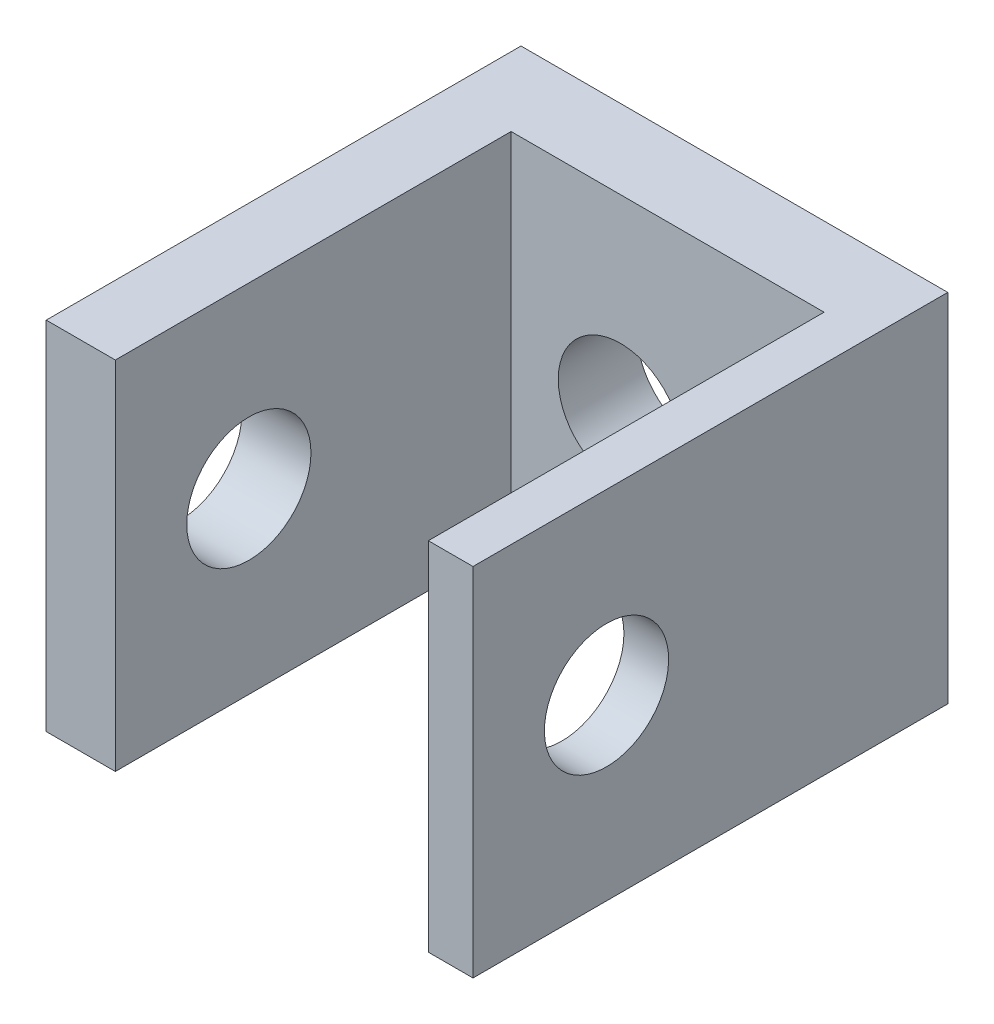
ISO-10303-21;
HEADER;
FILE_DESCRIPTION(('STEP AP214'),'2;1');
FILE_NAME('part.step','',(''),(''),'','','');
FILE_SCHEMA(('AUTOMOTIVE_DESIGN { 1 0 10303 214 1 1 1 1 }'));
ENDSEC;
DATA;
#1=APPLICATION_CONTEXT('core data for automotive mechanical design processes');
#2=APPLICATION_PROTOCOL_DEFINITION('international standard','automotive_design',2000,#1);
#3=PRODUCT_CONTEXT('',#1,'mechanical');
#4=PRODUCT('Part','Part','',(#3));
#5=PRODUCT_RELATED_PRODUCT_CATEGORY('part','',(#4));
#6=PRODUCT_DEFINITION_FORMATION('','',#4);
#7=PRODUCT_DEFINITION_CONTEXT('part definition',#1,'design');
#8=PRODUCT_DEFINITION('design','',#6,#7);
#9=PRODUCT_DEFINITION_SHAPE('','',#8);
#10=(LENGTH_UNIT() NAMED_UNIT(*) SI_UNIT(.MILLI.,.METRE.));
#11=(NAMED_UNIT(*) PLANE_ANGLE_UNIT() SI_UNIT($,.RADIAN.));
#12=(NAMED_UNIT(*) SI_UNIT($,.STERADIAN.) SOLID_ANGLE_UNIT());
#13=UNCERTAINTY_MEASURE_WITH_UNIT(LENGTH_MEASURE(1.E-05),#10,'distance_accuracy_value','');
#14=(GEOMETRIC_REPRESENTATION_CONTEXT(3) GLOBAL_UNCERTAINTY_ASSIGNED_CONTEXT((#13)) GLOBAL_UNIT_ASSIGNED_CONTEXT((#10,
#11,#12)) REPRESENTATION_CONTEXT('',''));
#15=CARTESIAN_POINT('',(0.,0.,0.));
#16=DIRECTION('',(0.,0.,1.));
#17=DIRECTION('',(1.,0.,0.));
#18=AXIS2_PLACEMENT_3D('',#15,#16,#17);
#19=CARTESIAN_POINT('',(0.,0.,3.18));
#20=DIRECTION('',(0.,0.,1.));
#21=DIRECTION('',(1.,0.,0.));
#22=AXIS2_PLACEMENT_3D('',#19,#20,#21);
#23=PLANE('',#22);
#24=CARTESIAN_POINT('',(0.,0.,3.18));
#25=DIRECTION('',(0.,0.,1.));
#26=DIRECTION('',(1.,0.,0.));
#27=AXIS2_PLACEMENT_3D('',#24,#25,#26);
#28=CIRCLE('',#27,2.5);
#29=CARTESIAN_POINT('',(-2.5,0.,3.18));
#30=VERTEX_POINT('',#29);
#31=EDGE_CURVE('E147',#30,#30,#28,.T.);
#32=ORIENTED_EDGE('',*,*,#31,.F.);
#33=EDGE_LOOP('',(#32));
#34=FACE_BOUND('',#33,.T.);
#35=DIRECTION('',(-1.,0.,0.));
#36=VECTOR('',#35,1.);
#37=CARTESIAN_POINT('',(9.99999999999986,7.6832495721817,3.18));
#38=LINE('',#37,#36);
#39=CARTESIAN_POINT('',(8.20161901152132,7.6832495721817,3.18));
#40=VERTEX_POINT('',#39);
#41=CARTESIAN_POINT('',(-4.39838098847867,7.6832495721817,3.18));
#42=VERTEX_POINT('',#41);
#43=EDGE_CURVE('E50',#40,#42,#38,.T.);
#44=ORIENTED_EDGE('',*,*,#43,.T.);
#45=DIRECTION('',(0.,1.,0.));
#46=VECTOR('',#45,1.);
#47=CARTESIAN_POINT('',(-4.39838098847868,7.6832495721817,3.18));
#48=LINE('',#47,#46);
#49=CARTESIAN_POINT('',(-4.39838098847867,-6.66388785141692,3.18));
#50=VERTEX_POINT('',#49);
#51=EDGE_CURVE('E121',#50,#42,#48,.T.);
#52=ORIENTED_EDGE('',*,*,#51,.F.);
#53=DIRECTION('',(1.,0.,0.));
#54=VECTOR('',#53,1.);
#55=CARTESIAN_POINT('',(-7.18000000245512,-6.66388785141692,3.18));
#56=LINE('',#55,#54);
#57=CARTESIAN_POINT('',(8.20161901152132,-6.66388785141692,3.18));
#58=VERTEX_POINT('',#57);
#59=EDGE_CURVE('E162',#50,#58,#56,.T.);
#60=ORIENTED_EDGE('',*,*,#59,.T.);
#61=DIRECTION('',(0.,-1.,0.));
#62=VECTOR('',#61,1.);
#63=CARTESIAN_POINT('',(8.20161901152132,-6.66388785141692,3.18));
#64=LINE('',#63,#62);
#65=EDGE_CURVE('E55',#40,#58,#64,.T.);
#66=ORIENTED_EDGE('',*,*,#65,.F.);
#67=EDGE_LOOP('',(#44,#52,#60,#66));
#68=FACE_BOUND('',#67,.T.);
#69=ADVANCED_FACE('F33',(#34,#68),#23,.T.);
#70=CARTESIAN_POINT('',(0.,0.,0.));
#71=DIRECTION('',(0.,0.,1.));
#72=DIRECTION('',(1.,0.,0.));
#73=AXIS2_PLACEMENT_3D('',#70,#71,#72);
#74=PLANE('',#73);
#75=DIRECTION('',(-1.,0.,0.));
#76=VECTOR('',#75,1.);
#77=CARTESIAN_POINT('',(9.99999999999986,7.6832495721817,0.));
#78=LINE('',#77,#76);
#79=CARTESIAN_POINT('',(9.99999999999986,7.6832495721817,0.));
#80=VERTEX_POINT('',#79);
#81=CARTESIAN_POINT('',(-7.18000000245513,7.6832495721817,0.));
#82=VERTEX_POINT('',#81);
#83=EDGE_CURVE('E168',#80,#82,#78,.T.);
#84=ORIENTED_EDGE('',*,*,#83,.F.);
#85=DIRECTION('',(0.,1.,0.));
#86=VECTOR('',#85,1.);
#87=CARTESIAN_POINT('',(9.99999999999986,7.6832495721817,0.));
#88=LINE('',#87,#86);
#89=CARTESIAN_POINT('',(10.,-6.66388785141692,0.));
#90=VERTEX_POINT('',#89);
#91=EDGE_CURVE('E174',#90,#80,#88,.T.);
#92=ORIENTED_EDGE('',*,*,#91,.F.);
#93=DIRECTION('',(1.,0.,0.));
#94=VECTOR('',#93,1.);
#95=CARTESIAN_POINT('',(-7.18000000245512,-6.66388785141692,0.));
#96=LINE('',#95,#94);
#97=CARTESIAN_POINT('',(-7.18000000245512,-6.66388785141692,0.));
#98=VERTEX_POINT('',#97);
#99=EDGE_CURVE('E172',#98,#90,#96,.T.);
#100=ORIENTED_EDGE('',*,*,#99,.F.);
#101=DIRECTION('',(0.,-1.,0.));
#102=VECTOR('',#101,1.);
#103=CARTESIAN_POINT('',(-7.18000000245513,7.6832495721817,0.));
#104=LINE('',#103,#102);
#105=EDGE_CURVE('E103',#82,#98,#104,.T.);
#106=ORIENTED_EDGE('',*,*,#105,.F.);
#107=EDGE_LOOP('',(#84,#92,#100,#106));
#108=FACE_BOUND('',#107,.T.);
#109=CARTESIAN_POINT('',(0.,0.,0.));
#110=DIRECTION('',(0.,0.,1.));
#111=DIRECTION('',(1.,0.,0.));
#112=AXIS2_PLACEMENT_3D('',#109,#110,#111);
#113=CIRCLE('',#112,2.5);
#114=CARTESIAN_POINT('',(-2.5,0.,0.));
#115=VERTEX_POINT('',#114);
#116=EDGE_CURVE('E160',#115,#115,#113,.T.);
#117=ORIENTED_EDGE('',*,*,#116,.T.);
#118=EDGE_LOOP('',(#117));
#119=FACE_BOUND('',#118,.T.);
#120=ADVANCED_FACE('F186',(#108,#119),#74,.F.);
#121=CARTESIAN_POINT('',(9.99999999999986,7.6832495721817,3.18));
#122=DIRECTION('',(0.,-1.,0.));
#123=DIRECTION('',(0.,0.,-1.));
#124=AXIS2_PLACEMENT_3D('',#121,#122,#123);
#125=PLANE('',#124);
#126=ORIENTED_EDGE('',*,*,#83,.T.);
#127=DIRECTION('',(0.,0.,-1.));
#128=VECTOR('',#127,1.);
#129=CARTESIAN_POINT('',(-7.18000000245513,7.6832495721817,3.18));
#130=LINE('',#129,#128);
#131=CARTESIAN_POINT('',(-7.18000000245513,7.6832495721817,19.1124758412478));
#132=VERTEX_POINT('',#131);
#133=EDGE_CURVE('E11',#132,#82,#130,.T.);
#134=ORIENTED_EDGE('',*,*,#133,.F.);
#135=DIRECTION('',(-1.,0.,0.));
#136=VECTOR('',#135,1.);
#137=CARTESIAN_POINT('',(-7.18000000245513,7.6832495721817,19.1124758412478));
#138=LINE('',#137,#136);
#139=CARTESIAN_POINT('',(-4.39838098847868,7.6832495721817,19.1124758412478));
#140=VERTEX_POINT('',#139);
#141=EDGE_CURVE('E120',#140,#132,#138,.T.);
#142=ORIENTED_EDGE('',*,*,#141,.F.);
#143=DIRECTION('',(0.,0.,-1.));
#144=VECTOR('',#143,1.);
#145=CARTESIAN_POINT('',(-4.39838098847868,7.6832495721817,19.1124758412478));
#146=LINE('',#145,#144);
#147=EDGE_CURVE('E129',#140,#42,#146,.T.);
#148=ORIENTED_EDGE('',*,*,#147,.T.);
#149=ORIENTED_EDGE('',*,*,#43,.F.);
#150=DIRECTION('',(0.,0.,-1.));
#151=VECTOR('',#150,1.);
#152=CARTESIAN_POINT('',(8.20161901152132,7.6832495721817,19.1124758412478));
#153=LINE('',#152,#151);
#154=CARTESIAN_POINT('',(8.20161901152132,7.6832495721817,19.1124758412478));
#155=VERTEX_POINT('',#154);
#156=EDGE_CURVE('E155',#155,#40,#153,.T.);
#157=ORIENTED_EDGE('',*,*,#156,.F.);
#158=DIRECTION('',(-1.,0.,0.));
#159=VECTOR('',#158,1.);
#160=CARTESIAN_POINT('',(10.,7.6832495721817,19.1124758412478));
#161=LINE('',#160,#159);
#162=CARTESIAN_POINT('',(10.,7.6832495721817,19.1124758412478));
#163=VERTEX_POINT('',#162);
#164=EDGE_CURVE('E137',#163,#155,#161,.T.);
#165=ORIENTED_EDGE('',*,*,#164,.F.);
#166=DIRECTION('',(0.,0.,-1.));
#167=VECTOR('',#166,1.);
#168=CARTESIAN_POINT('',(9.99999999999986,7.6832495721817,3.18));
#169=LINE('',#168,#167);
#170=EDGE_CURVE('E164',#163,#80,#169,.T.);
#171=ORIENTED_EDGE('',*,*,#170,.T.);
#172=EDGE_LOOP('',(#126,#134,#142,#148,#149,#157,#165,#171));
#173=FACE_BOUND('',#172,.T.);
#174=ADVANCED_FACE('F35',(#173),#125,.F.);
#175=CARTESIAN_POINT('',(-7.18000000245513,7.6832495721817,3.18));
#176=DIRECTION('',(1.,0.,0.));
#177=DIRECTION('',(0.,1.,0.));
#178=AXIS2_PLACEMENT_3D('',#175,#176,#177);
#179=PLANE('',#178);
#180=CARTESIAN_POINT('',(-7.18000000245522,0.509680860382169,13.7375000011501));
#181=DIRECTION('',(1.,0.,0.));
#182=DIRECTION('',(0.,1.,0.));
#183=AXIS2_PLACEMENT_3D('',#180,#181,#182);
#184=CIRCLE('',#183,2.5);
#185=CARTESIAN_POINT('',(-7.18000000245525,3.00968086038217,13.7375000011501));
#186=VERTEX_POINT('',#185);
#187=EDGE_CURVE('E230',#186,#186,#184,.T.);
#188=ORIENTED_EDGE('',*,*,#187,.T.);
#189=EDGE_LOOP('',(#188));
#190=FACE_BOUND('',#189,.T.);
#191=ORIENTED_EDGE('',*,*,#105,.T.);
#192=DIRECTION('',(0.,0.,-1.));
#193=VECTOR('',#192,1.);
#194=CARTESIAN_POINT('',(-7.18000000245512,-6.66388785141692,3.18));
#195=LINE('',#194,#193);
#196=CARTESIAN_POINT('',(-7.18000000245513,-6.66388785141692,19.1124758412478));
#197=VERTEX_POINT('',#196);
#198=EDGE_CURVE('E42',#197,#98,#195,.T.);
#199=ORIENTED_EDGE('',*,*,#198,.F.);
#200=DIRECTION('',(0.,-1.,0.));
#201=VECTOR('',#200,1.);
#202=CARTESIAN_POINT('',(-7.18000000245513,7.6832495721817,19.1124758412478));
#203=LINE('',#202,#201);
#204=EDGE_CURVE('E102',#132,#197,#203,.T.);
#205=ORIENTED_EDGE('',*,*,#204,.F.);
#206=ORIENTED_EDGE('',*,*,#133,.T.);
#207=EDGE_LOOP('',(#191,#199,#205,#206));
#208=FACE_BOUND('',#207,.T.);
#209=ADVANCED_FACE('F100',(#190,#208),#179,.F.);
#210=CARTESIAN_POINT('',(-7.18000000245512,-6.66388785141692,3.18));
#211=DIRECTION('',(0.,1.,0.));
#212=DIRECTION('',(0.,0.,1.));
#213=AXIS2_PLACEMENT_3D('',#210,#211,#212);
#214=PLANE('',#213);
#215=ORIENTED_EDGE('',*,*,#99,.T.);
#216=DIRECTION('',(0.,0.,-1.));
#217=VECTOR('',#216,1.);
#218=CARTESIAN_POINT('',(10.,-6.66388785141692,3.18));
#219=LINE('',#218,#217);
#220=CARTESIAN_POINT('',(10.,-6.66388785141692,19.1124758412478));
#221=VERTEX_POINT('',#220);
#222=EDGE_CURVE('E106',#221,#90,#219,.T.);
#223=ORIENTED_EDGE('',*,*,#222,.F.);
#224=DIRECTION('',(1.,0.,0.));
#225=VECTOR('',#224,1.);
#226=CARTESIAN_POINT('',(10.,-6.66388785141692,19.1124758412478));
#227=LINE('',#226,#225);
#228=CARTESIAN_POINT('',(8.20161901152132,-6.66388785141692,19.1124758412478));
#229=VERTEX_POINT('',#228);
#230=EDGE_CURVE('E141',#229,#221,#227,.T.);
#231=ORIENTED_EDGE('',*,*,#230,.F.);
#232=DIRECTION('',(0.,0.,-1.));
#233=VECTOR('',#232,1.);
#234=CARTESIAN_POINT('',(8.20161901152132,-6.66388785141692,19.1124758412478));
#235=LINE('',#234,#233);
#236=EDGE_CURVE('E144',#229,#58,#235,.T.);
#237=ORIENTED_EDGE('',*,*,#236,.T.);
#238=ORIENTED_EDGE('',*,*,#59,.F.);
#239=DIRECTION('',(0.,0.,-1.));
#240=VECTOR('',#239,1.);
#241=CARTESIAN_POINT('',(-4.39838098847867,-6.66388785141692,19.1124758412478));
#242=LINE('',#241,#240);
#243=CARTESIAN_POINT('',(-4.39838098847867,-6.66388785141692,19.1124758412478));
#244=VERTEX_POINT('',#243);
#245=EDGE_CURVE('E112',#244,#50,#242,.T.);
#246=ORIENTED_EDGE('',*,*,#245,.F.);
#247=DIRECTION('',(1.,0.,0.));
#248=VECTOR('',#247,1.);
#249=CARTESIAN_POINT('',(-7.18000000245513,-6.66388785141692,19.1124758412478));
#250=LINE('',#249,#248);
#251=EDGE_CURVE('E109',#197,#244,#250,.T.);
#252=ORIENTED_EDGE('',*,*,#251,.F.);
#253=ORIENTED_EDGE('',*,*,#198,.T.);
#254=EDGE_LOOP('',(#215,#223,#231,#237,#238,#246,#252,#253));
#255=FACE_BOUND('',#254,.T.);
#256=ADVANCED_FACE('F110',(#255),#214,.F.);
#257=CARTESIAN_POINT('',(9.99999999999986,7.6832495721817,3.18));
#258=DIRECTION('',(-1.,0.,0.));
#259=DIRECTION('',(0.,-1.,0.));
#260=AXIS2_PLACEMENT_3D('',#257,#258,#259);
#261=PLANE('',#260);
#262=CARTESIAN_POINT('',(9.99999999999995,0.509680860382389,13.7375000011501));
#263=DIRECTION('',(1.,0.,0.));
#264=DIRECTION('',(0.,1.,0.));
#265=AXIS2_PLACEMENT_3D('',#262,#263,#264);
#266=CIRCLE('',#265,2.5);
#267=CARTESIAN_POINT('',(9.99999999999992,3.00968086038239,13.7375000011501));
#268=VERTEX_POINT('',#267);
#269=EDGE_CURVE('E232',#268,#268,#266,.T.);
#270=ORIENTED_EDGE('',*,*,#269,.F.);
#271=EDGE_LOOP('',(#270));
#272=FACE_BOUND('',#271,.T.);
#273=ORIENTED_EDGE('',*,*,#91,.T.);
#274=ORIENTED_EDGE('',*,*,#170,.F.);
#275=DIRECTION('',(0.,1.,0.));
#276=VECTOR('',#275,1.);
#277=CARTESIAN_POINT('',(10.,-6.66388785141692,19.1124758412478));
#278=LINE('',#277,#276);
#279=EDGE_CURVE('E134',#221,#163,#278,.T.);
#280=ORIENTED_EDGE('',*,*,#279,.F.);
#281=ORIENTED_EDGE('',*,*,#222,.T.);
#282=EDGE_LOOP('',(#273,#274,#280,#281));
#283=FACE_BOUND('',#282,.T.);
#284=ADVANCED_FACE('F182',(#272,#283),#261,.F.);
#285=CARTESIAN_POINT('',(0.,0.,3.18));
#286=DIRECTION('',(0.,0.,-1.));
#287=DIRECTION('',(-1.,0.,0.));
#288=AXIS2_PLACEMENT_3D('',#285,#286,#287);
#289=CYLINDRICAL_SURFACE('',#288,2.5);
#290=CARTESIAN_POINT('',(-2.5,0.,3.18));
#291=CARTESIAN_POINT('',(-2.5,0.,3.146875));
#292=CARTESIAN_POINT('',(-2.5,0.,3.11375));
#293=CARTESIAN_POINT('',(-2.5,0.,3.0475));
#294=CARTESIAN_POINT('',(-2.5,0.,3.014375));
#295=CARTESIAN_POINT('',(-2.5,0.,2.948125));
#296=CARTESIAN_POINT('',(-2.5,0.,2.915));
#297=CARTESIAN_POINT('',(-2.5,0.,2.84875));
#298=CARTESIAN_POINT('',(-2.5,0.,2.815625));
#299=CARTESIAN_POINT('',(-2.5,0.,2.749375));
#300=CARTESIAN_POINT('',(-2.5,0.,2.71625));
#301=CARTESIAN_POINT('',(-2.5,0.,2.65));
#302=CARTESIAN_POINT('',(-2.5,0.,2.616875));
#303=CARTESIAN_POINT('',(-2.5,0.,2.550625));
#304=CARTESIAN_POINT('',(-2.5,0.,2.5175));
#305=CARTESIAN_POINT('',(-2.5,0.,2.45125));
#306=CARTESIAN_POINT('',(-2.5,0.,2.418125));
#307=CARTESIAN_POINT('',(-2.5,0.,2.351875));
#308=CARTESIAN_POINT('',(-2.5,0.,2.31875));
#309=CARTESIAN_POINT('',(-2.5,0.,2.2525));
#310=CARTESIAN_POINT('',(-2.5,0.,2.219375));
#311=CARTESIAN_POINT('',(-2.5,0.,2.153125));
#312=CARTESIAN_POINT('',(-2.5,0.,2.12));
#313=CARTESIAN_POINT('',(-2.5,0.,2.05375));
#314=CARTESIAN_POINT('',(-2.5,0.,2.020625));
#315=CARTESIAN_POINT('',(-2.5,0.,1.954375));
#316=CARTESIAN_POINT('',(-2.5,0.,1.92125));
#317=CARTESIAN_POINT('',(-2.5,0.,1.855));
#318=CARTESIAN_POINT('',(-2.5,0.,1.821875));
#319=CARTESIAN_POINT('',(-2.5,0.,1.755625));
#320=CARTESIAN_POINT('',(-2.5,0.,1.7225));
#321=CARTESIAN_POINT('',(-2.5,0.,1.65625));
#322=CARTESIAN_POINT('',(-2.5,0.,1.623125));
#323=CARTESIAN_POINT('',(-2.5,0.,1.556875));
#324=CARTESIAN_POINT('',(-2.5,0.,1.52375));
#325=CARTESIAN_POINT('',(-2.5,0.,1.4575));
#326=CARTESIAN_POINT('',(-2.5,0.,1.424375));
#327=CARTESIAN_POINT('',(-2.5,0.,1.358125));
#328=CARTESIAN_POINT('',(-2.5,0.,1.325));
#329=CARTESIAN_POINT('',(-2.5,0.,1.25875));
#330=CARTESIAN_POINT('',(-2.5,0.,1.225625));
#331=CARTESIAN_POINT('',(-2.5,0.,1.159375));
#332=CARTESIAN_POINT('',(-2.5,0.,1.12625));
#333=CARTESIAN_POINT('',(-2.5,0.,1.06));
#334=CARTESIAN_POINT('',(-2.5,0.,1.026875));
#335=CARTESIAN_POINT('',(-2.5,0.,0.960625));
#336=CARTESIAN_POINT('',(-2.5,0.,0.9275));
#337=CARTESIAN_POINT('',(-2.5,0.,0.86125));
#338=CARTESIAN_POINT('',(-2.5,0.,0.828125));
#339=CARTESIAN_POINT('',(-2.5,0.,0.761875));
#340=CARTESIAN_POINT('',(-2.5,0.,0.72875));
#341=CARTESIAN_POINT('',(-2.5,0.,0.6625));
#342=CARTESIAN_POINT('',(-2.5,0.,0.629375));
#343=CARTESIAN_POINT('',(-2.5,0.,0.563125));
#344=CARTESIAN_POINT('',(-2.5,0.,0.53));
#345=CARTESIAN_POINT('',(-2.5,0.,0.46375));
#346=CARTESIAN_POINT('',(-2.5,0.,0.430625));
#347=CARTESIAN_POINT('',(-2.5,0.,0.364375));
#348=CARTESIAN_POINT('',(-2.5,0.,0.33125));
#349=CARTESIAN_POINT('',(-2.5,0.,0.265));
#350=CARTESIAN_POINT('',(-2.5,0.,0.231875));
#351=CARTESIAN_POINT('',(-2.5,0.,0.165625));
#352=CARTESIAN_POINT('',(-2.5,0.,0.1325));
#353=CARTESIAN_POINT('',(-2.5,0.,0.06625));
#354=CARTESIAN_POINT('',(-2.5,0.,0.033125));
#355=CARTESIAN_POINT('',(-2.5,0.,0.));
#356=B_SPLINE_CURVE_WITH_KNOTS('',3,(#290,#291,#292,#293,#294,#295,#296,#297,#298,#299,#300,
#301,#302,#303,#304,#305,#306,#307,#308,#309,#310,#311,#312,#313,#314,#315,#316,#317,#318,#319,
#320,#321,#322,#323,#324,#325,#326,#327,#328,#329,#330,#331,#332,#333,#334,#335,#336,#337,#338,
#339,#340,#341,#342,#343,#344,#345,#346,#347,#348,#349,#350,#351,#352,#353,#354,#355),
.UNSPECIFIED.,.F.,.F.,(4,2,2,2,2,2,2,2,2,2,2,2,2,2,2,2,2,2,2,2,2,2,2,2,2,2,2,2,2,2,2,2,4),(0.,
0.0993750000000001,0.19875,0.298125,0.3975,0.496875,0.59625,0.695625,0.795,0.894375,0.99375,
1.093125,1.1925,1.291875,1.39125,1.490625,1.59,1.689375,1.78875,1.888125,1.9875,2.086875,
2.18625,2.285625,2.385,2.484375,2.58375,2.683125,2.7825,2.881875,2.98125,3.080625,3.18),.UNSPECIFIED.);
#357=EDGE_CURVE('BSEAM198',#30,#115,#356,.T.);
#358=ORIENTED_EDGE('',*,*,#31,.T.);
#359=ORIENTED_EDGE('',*,*,#116,.F.);
#360=ORIENTED_EDGE('',*,*,#357,.T.);
#361=ORIENTED_EDGE('',*,*,#357,.F.);
#362=EDGE_LOOP('',(#358,#360,#359,#361));
#363=FACE_BOUND('',#362,.T.);
#364=ADVANCED_FACE('F198',(#363),#289,.F.);
#365=CARTESIAN_POINT('',(8.20161901152132,-6.66388785141692,19.1124758412478));
#366=DIRECTION('',(1.,0.,0.));
#367=DIRECTION('',(0.,0.,-1.));
#368=AXIS2_PLACEMENT_3D('',#365,#366,#367);
#369=PLANE('',#368);
#370=CARTESIAN_POINT('',(8.20161901152132,0.509680860382366,13.7375000011501));
#371=DIRECTION('',(1.,0.,0.));
#372=DIRECTION('',(0.,0.,-1.));
#373=AXIS2_PLACEMENT_3D('',#370,#371,#372);
#374=CIRCLE('',#373,2.5);
#375=CARTESIAN_POINT('',(8.20161901152132,0.509680860382366,11.2375000011501));
#376=VERTEX_POINT('',#375);
#377=EDGE_CURVE('E123',#376,#376,#374,.T.);
#378=ORIENTED_EDGE('',*,*,#377,.T.);
#379=EDGE_LOOP('',(#378));
#380=FACE_BOUND('',#379,.T.);
#381=ORIENTED_EDGE('',*,*,#65,.T.);
#382=ORIENTED_EDGE('',*,*,#236,.F.);
#383=DIRECTION('',(0.,-1.,0.));
#384=VECTOR('',#383,1.);
#385=CARTESIAN_POINT('',(8.20161901152132,-6.66388785141692,19.1124758412478));
#386=LINE('',#385,#384);
#387=EDGE_CURVE('E139',#155,#229,#386,.T.);
#388=ORIENTED_EDGE('',*,*,#387,.F.);
#389=ORIENTED_EDGE('',*,*,#156,.T.);
#390=EDGE_LOOP('',(#381,#382,#388,#389));
#391=FACE_BOUND('',#390,.T.);
#392=ADVANCED_FACE('F196',(#380,#391),#369,.F.);
#393=CARTESIAN_POINT('',(0.,0.,19.1124758412478));
#394=DIRECTION('',(0.,0.,1.));
#395=DIRECTION('',(1.,0.,0.));
#396=AXIS2_PLACEMENT_3D('',#393,#394,#395);
#397=PLANE('',#396);
#398=ORIENTED_EDGE('',*,*,#279,.T.);
#399=ORIENTED_EDGE('',*,*,#164,.T.);
#400=ORIENTED_EDGE('',*,*,#387,.T.);
#401=ORIENTED_EDGE('',*,*,#230,.T.);
#402=EDGE_LOOP('',(#398,#399,#400,#401));
#403=FACE_BOUND('',#402,.T.);
#404=ADVANCED_FACE('F193',(#403),#397,.T.);
#405=CARTESIAN_POINT('',(-4.39838098847868,7.6832495721817,19.1124758412478));
#406=DIRECTION('',(-1.,0.,0.));
#407=DIRECTION('',(0.,-1.,0.));
#408=AXIS2_PLACEMENT_3D('',#405,#406,#407);
#409=PLANE('',#408);
#410=CARTESIAN_POINT('',(-4.39838098847868,0.509680860382205,13.7375000011501));
#411=DIRECTION('',(-1.,0.,0.));
#412=DIRECTION('',(0.,-1.,0.));
#413=AXIS2_PLACEMENT_3D('',#410,#411,#412);
#414=CIRCLE('',#413,2.5);
#415=CARTESIAN_POINT('',(-4.39838098847868,-1.9903191396178,13.7375000011501));
#416=VERTEX_POINT('',#415);
#417=EDGE_CURVE('E37',#416,#416,#414,.T.);
#418=ORIENTED_EDGE('',*,*,#417,.T.);
#419=EDGE_LOOP('',(#418));
#420=FACE_BOUND('',#419,.T.);
#421=ORIENTED_EDGE('',*,*,#51,.T.);
#422=ORIENTED_EDGE('',*,*,#147,.F.);
#423=DIRECTION('',(0.,1.,0.));
#424=VECTOR('',#423,1.);
#425=CARTESIAN_POINT('',(-4.39838098847868,7.6832495721817,19.1124758412478));
#426=LINE('',#425,#424);
#427=EDGE_CURVE('E115',#244,#140,#426,.T.);
#428=ORIENTED_EDGE('',*,*,#427,.F.);
#429=ORIENTED_EDGE('',*,*,#245,.T.);
#430=EDGE_LOOP('',(#421,#422,#428,#429));
#431=FACE_BOUND('',#430,.T.);
#432=ADVANCED_FACE('F205',(#420,#431),#409,.F.);
#433=CARTESIAN_POINT('',(0.,0.,19.1124758412478));
#434=DIRECTION('',(0.,0.,1.));
#435=DIRECTION('',(1.,0.,0.));
#436=AXIS2_PLACEMENT_3D('',#433,#434,#435);
#437=PLANE('',#436);
#438=ORIENTED_EDGE('',*,*,#204,.T.);
#439=ORIENTED_EDGE('',*,*,#251,.T.);
#440=ORIENTED_EDGE('',*,*,#427,.T.);
#441=ORIENTED_EDGE('',*,*,#141,.T.);
#442=EDGE_LOOP('',(#438,#439,#440,#441));
#443=FACE_BOUND('',#442,.T.);
#444=ADVANCED_FACE('F118',(#443),#437,.T.);
#445=CARTESIAN_POINT('',(-7.18000000245522,0.509680860382169,13.7375000011501));
#446=DIRECTION('',(1.,0.,0.));
#447=DIRECTION('',(0.,1.,0.));
#448=AXIS2_PLACEMENT_3D('',#445,#446,#447);
#449=CYLINDRICAL_SURFACE('',#448,2.5);
#450=ORIENTED_EDGE('',*,*,#187,.F.);
#451=EDGE_LOOP('',(#450));
#452=FACE_BOUND('',#451,.T.);
#453=ORIENTED_EDGE('',*,*,#417,.F.);
#454=EDGE_LOOP('',(#453));
#455=FACE_BOUND('',#454,.T.);
#456=ADVANCED_FACE('F241',(#452,#455),#449,.F.);
#457=ORIENTED_EDGE('',*,*,#269,.T.);
#458=EDGE_LOOP('',(#457));
#459=FACE_BOUND('',#458,.T.);
#460=ORIENTED_EDGE('',*,*,#377,.F.);
#461=EDGE_LOOP('',(#460));
#462=FACE_BOUND('',#461,.T.);
#463=ADVANCED_FACE('F238',(#459,#462),#449,.F.);
#464=CLOSED_SHELL('',(#69,#120,#174,#209,#256,#284,#364,#392,#404,#432,#444,#456,#463));
#465=MANIFOLD_SOLID_BREP('B2',#464);
#466=ADVANCED_BREP_SHAPE_REPRESENTATION('',(#18,#465),#14);
#467=SHAPE_DEFINITION_REPRESENTATION(#9,#466);
ENDSEC;
END-ISO-10303-21;
